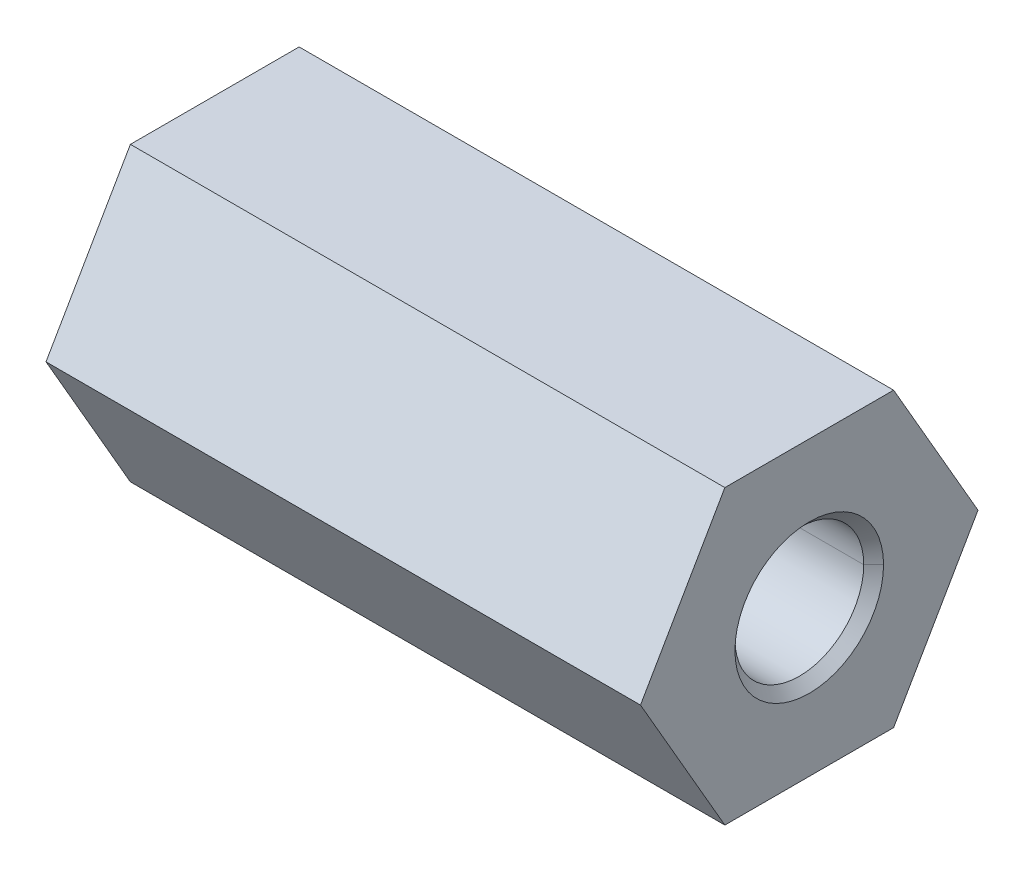
ISO-10303-21;
HEADER;
FILE_DESCRIPTION(('STEP AP214'),'2;1');
FILE_NAME('part.step','',(''),(''),'','','');
FILE_SCHEMA(('AUTOMOTIVE_DESIGN { 1 0 10303 214 1 1 1 1 }'));
ENDSEC;
DATA;
#1=APPLICATION_CONTEXT('core data for automotive mechanical design processes');
#2=APPLICATION_PROTOCOL_DEFINITION('international standard','automotive_design',2000,#1);
#3=PRODUCT_CONTEXT('',#1,'mechanical');
#4=PRODUCT('Part','Part','',(#3));
#5=PRODUCT_RELATED_PRODUCT_CATEGORY('part','',(#4));
#6=PRODUCT_DEFINITION_FORMATION('','',#4);
#7=PRODUCT_DEFINITION_CONTEXT('part definition',#1,'design');
#8=PRODUCT_DEFINITION('design','',#6,#7);
#9=PRODUCT_DEFINITION_SHAPE('','',#8);
#10=(LENGTH_UNIT() NAMED_UNIT(*) SI_UNIT(.MILLI.,.METRE.));
#11=(NAMED_UNIT(*) PLANE_ANGLE_UNIT() SI_UNIT($,.RADIAN.));
#12=(NAMED_UNIT(*) SI_UNIT($,.STERADIAN.) SOLID_ANGLE_UNIT());
#13=UNCERTAINTY_MEASURE_WITH_UNIT(LENGTH_MEASURE(1.E-05),#10,'distance_accuracy_value','');
#14=(GEOMETRIC_REPRESENTATION_CONTEXT(3) GLOBAL_UNCERTAINTY_ASSIGNED_CONTEXT((#13)) GLOBAL_UNIT_ASSIGNED_CONTEXT((#10,
#11,#12)) REPRESENTATION_CONTEXT('',''));
#15=CARTESIAN_POINT('',(0.,0.,0.));
#16=DIRECTION('',(0.,0.,1.));
#17=DIRECTION('',(1.,0.,0.));
#18=AXIS2_PLACEMENT_3D('',#15,#16,#17);
#19=CARTESIAN_POINT('',(11.8,0.,0.));
#20=DIRECTION('',(1.,0.,0.));
#21=DIRECTION('',(0.,0.,-1.));
#22=AXIS2_PLACEMENT_3D('',#19,#20,#21);
#23=CONICAL_SURFACE('',#22,1.3,0.785398163397446);
#24=DIRECTION('',(0.707106781186549,0.,0.707106781186546));
#25=VECTOR('',#24,1.);
#26=CARTESIAN_POINT('',(11.8,0.,1.3));
#27=LINE('',#26,#25);
#28=CARTESIAN_POINT('',(11.8,0.,1.3));
#29=VERTEX_POINT('',#28);
#30=CARTESIAN_POINT('',(12.,0.,1.5));
#31=VERTEX_POINT('',#30);
#32=EDGE_CURVE('E310',#29,#31,#27,.T.);
#33=ORIENTED_EDGE('',*,*,#32,.F.);
#34=CARTESIAN_POINT('',(11.8,0.,0.));
#35=DIRECTION('',(1.,0.,0.));
#36=DIRECTION('',(0.,0.,-1.));
#37=AXIS2_PLACEMENT_3D('',#34,#35,#36);
#38=CIRCLE('',#37,1.3);
#39=CARTESIAN_POINT('',(11.8,0.,-1.3));
#40=VERTEX_POINT('',#39);
#41=EDGE_CURVE('E10',#40,#29,#38,.T.);
#42=ORIENTED_EDGE('',*,*,#41,.F.);
#43=DIRECTION('',(0.707106781186549,0.,-0.707106781186546));
#44=VECTOR('',#43,1.);
#45=CARTESIAN_POINT('',(11.8,0.,-1.3));
#46=LINE('',#45,#44);
#47=CARTESIAN_POINT('',(12.,0.,-1.5));
#48=VERTEX_POINT('',#47);
#49=EDGE_CURVE('E273',#40,#48,#46,.T.);
#50=ORIENTED_EDGE('',*,*,#49,.T.);
#51=CARTESIAN_POINT('',(12.,0.,0.));
#52=DIRECTION('',(-1.,0.,0.));
#53=DIRECTION('',(0.,0.,-1.));
#54=AXIS2_PLACEMENT_3D('',#51,#52,#53);
#55=CIRCLE('',#54,1.5);
#56=EDGE_CURVE('E233',#31,#48,#55,.T.);
#57=ORIENTED_EDGE('',*,*,#56,.F.);
#58=EDGE_LOOP('',(#33,#42,#50,#57));
#59=FACE_BOUND('',#58,.T.);
#60=ADVANCED_FACE('F16',(#59),#23,.F.);
#61=CARTESIAN_POINT('',(0.,0.,0.));
#62=DIRECTION('',(1.,0.,0.));
#63=DIRECTION('',(0.,0.,-1.));
#64=AXIS2_PLACEMENT_3D('',#61,#62,#63);
#65=CYLINDRICAL_SURFACE('',#64,1.3);
#66=DIRECTION('',(1.,0.,0.));
#67=VECTOR('',#66,1.);
#68=CARTESIAN_POINT('',(0.,0.,1.3));
#69=LINE('',#68,#67);
#70=CARTESIAN_POINT('',(8.,0.,1.3));
#71=VERTEX_POINT('',#70);
#72=EDGE_CURVE('E258',#71,#29,#69,.T.);
#73=ORIENTED_EDGE('',*,*,#72,.F.);
#74=CARTESIAN_POINT('',(8.,0.,0.));
#75=DIRECTION('',(-1.,0.,0.));
#76=DIRECTION('',(0.,0.,1.));
#77=AXIS2_PLACEMENT_3D('',#74,#75,#76);
#78=CIRCLE('',#77,1.3);
#79=CARTESIAN_POINT('',(8.,0.,-1.3));
#80=VERTEX_POINT('',#79);
#81=EDGE_CURVE('E24',#71,#80,#78,.T.);
#82=ORIENTED_EDGE('',*,*,#81,.T.);
#83=DIRECTION('',(1.,0.,0.));
#84=VECTOR('',#83,1.);
#85=CARTESIAN_POINT('',(0.,0.,-1.3));
#86=LINE('',#85,#84);
#87=EDGE_CURVE('E255',#80,#40,#86,.T.);
#88=ORIENTED_EDGE('',*,*,#87,.T.);
#89=ORIENTED_EDGE('',*,*,#41,.T.);
#90=EDGE_LOOP('',(#73,#82,#88,#89));
#91=FACE_BOUND('',#90,.T.);
#92=ADVANCED_FACE('F254',(#91),#65,.F.);
#93=CARTESIAN_POINT('',(8.,0.,0.));
#94=DIRECTION('',(-1.,0.,0.));
#95=DIRECTION('',(0.,0.,1.));
#96=AXIS2_PLACEMENT_3D('',#93,#94,#95);
#97=PLANE('',#96);
#98=CARTESIAN_POINT('',(8.,0.,0.));
#99=DIRECTION('',(-1.,0.,0.));
#100=DIRECTION('',(0.,0.,1.));
#101=AXIS2_PLACEMENT_3D('',#98,#99,#100);
#102=CIRCLE('',#101,1.3);
#103=EDGE_CURVE('E265',#80,#71,#102,.T.);
#104=ORIENTED_EDGE('',*,*,#103,.F.);
#105=ORIENTED_EDGE('',*,*,#81,.F.);
#106=EDGE_LOOP('',(#104,#105));
#107=FACE_BOUND('',#106,.T.);
#108=CARTESIAN_POINT('',(8.,0.,0.));
#109=DIRECTION('',(-1.,0.,0.));
#110=DIRECTION('',(0.,0.,1.));
#111=AXIS2_PLACEMENT_3D('',#108,#109,#110);
#112=CIRCLE('',#111,2.);
#113=CARTESIAN_POINT('',(8.,1.5,-1.32287565553229));
#114=VERTEX_POINT('',#113);
#115=CARTESIAN_POINT('',(8.,0.,-2.));
#116=VERTEX_POINT('',#115);
#117=EDGE_CURVE('E243',#114,#116,#112,.T.);
#118=ORIENTED_EDGE('',*,*,#117,.T.);
#119=CARTESIAN_POINT('',(8.,0.,0.));
#120=DIRECTION('',(-1.,0.,0.));
#121=DIRECTION('',(0.,0.,1.));
#122=AXIS2_PLACEMENT_3D('',#119,#120,#121);
#123=CIRCLE('',#122,2.);
#124=CARTESIAN_POINT('',(8.,0.,2.));
#125=VERTEX_POINT('',#124);
#126=EDGE_CURVE('E269',#116,#125,#123,.T.);
#127=ORIENTED_EDGE('',*,*,#126,.T.);
#128=CARTESIAN_POINT('',(8.,0.,0.));
#129=DIRECTION('',(-1.,0.,0.));
#130=DIRECTION('',(0.,0.,1.));
#131=AXIS2_PLACEMENT_3D('',#128,#129,#130);
#132=CIRCLE('',#131,2.);
#133=CARTESIAN_POINT('',(8.,1.5,1.32287565553229));
#134=VERTEX_POINT('',#133);
#135=EDGE_CURVE('E293',#125,#134,#132,.T.);
#136=ORIENTED_EDGE('',*,*,#135,.T.);
#137=DIRECTION('',(0.,0.,-1.));
#138=VECTOR('',#137,1.);
#139=CARTESIAN_POINT('',(8.,1.5,1.32287565553229));
#140=LINE('',#139,#138);
#141=EDGE_CURVE('E37',#134,#114,#140,.T.);
#142=ORIENTED_EDGE('',*,*,#141,.T.);
#143=EDGE_LOOP('',(#118,#127,#136,#142));
#144=FACE_BOUND('',#143,.T.);
#145=ADVANCED_FACE('F271',(#107,#144),#97,.T.);
#146=CARTESIAN_POINT('',(8.,1.5,1.32287565553229));
#147=DIRECTION('',(0.,1.,0.));
#148=DIRECTION('',(0.,0.,-1.));
#149=AXIS2_PLACEMENT_3D('',#146,#147,#148);
#150=PLANE('',#149);
#151=DIRECTION('',(0.,0.,-1.));
#152=VECTOR('',#151,1.);
#153=CARTESIAN_POINT('',(0.,1.5,1.32287565553229));
#154=LINE('',#153,#152);
#155=CARTESIAN_POINT('',(0.,1.5,1.32287565553229));
#156=VERTEX_POINT('',#155);
#157=CARTESIAN_POINT('',(0.,1.5,-1.32287565553229));
#158=VERTEX_POINT('',#157);
#159=EDGE_CURVE('E236',#156,#158,#154,.T.);
#160=ORIENTED_EDGE('',*,*,#159,.T.);
#161=DIRECTION('',(-1.,0.,0.));
#162=VECTOR('',#161,1.);
#163=CARTESIAN_POINT('',(8.,1.5,-1.32287565553229));
#164=LINE('',#163,#162);
#165=EDGE_CURVE('E47',#114,#158,#164,.T.);
#166=ORIENTED_EDGE('',*,*,#165,.F.);
#167=ORIENTED_EDGE('',*,*,#141,.F.);
#168=DIRECTION('',(-1.,0.,0.));
#169=VECTOR('',#168,1.);
#170=CARTESIAN_POINT('',(8.,1.5,1.32287565553229));
#171=LINE('',#170,#169);
#172=EDGE_CURVE('E174',#134,#156,#171,.T.);
#173=ORIENTED_EDGE('',*,*,#172,.T.);
#174=EDGE_LOOP('',(#160,#166,#167,#173));
#175=FACE_BOUND('',#174,.T.);
#176=ADVANCED_FACE('F365',(#175),#150,.F.);
#177=CARTESIAN_POINT('',(8.,0.,0.));
#178=DIRECTION('',(-1.,0.,0.));
#179=DIRECTION('',(0.,0.,1.));
#180=AXIS2_PLACEMENT_3D('',#177,#178,#179);
#181=CYLINDRICAL_SURFACE('',#180,2.);
#182=DIRECTION('',(-1.,0.,0.));
#183=VECTOR('',#182,1.);
#184=CARTESIAN_POINT('',(8.,0.,-2.));
#185=LINE('',#184,#183);
#186=CARTESIAN_POINT('',(0.,0.,-2.));
#187=VERTEX_POINT('',#186);
#188=EDGE_CURVE('E288',#116,#187,#185,.T.);
#189=ORIENTED_EDGE('',*,*,#188,.F.);
#190=ORIENTED_EDGE('',*,*,#117,.F.);
#191=ORIENTED_EDGE('',*,*,#165,.T.);
#192=CARTESIAN_POINT('',(0.,0.,0.));
#193=DIRECTION('',(-1.,0.,0.));
#194=DIRECTION('',(0.,0.,1.));
#195=AXIS2_PLACEMENT_3D('',#192,#193,#194);
#196=CIRCLE('',#195,2.);
#197=EDGE_CURVE('E240',#158,#187,#196,.T.);
#198=ORIENTED_EDGE('',*,*,#197,.T.);
#199=EDGE_LOOP('',(#189,#190,#191,#198));
#200=FACE_BOUND('',#199,.T.);
#201=ADVANCED_FACE('F360',(#200),#181,.F.);
#202=CARTESIAN_POINT('',(0.,0.,0.));
#203=DIRECTION('',(1.,0.,0.));
#204=DIRECTION('',(0.,1.,0.));
#205=AXIS2_PLACEMENT_3D('',#202,#203,#204);
#206=PLANE('',#205);
#207=ORIENTED_EDGE('',*,*,#159,.F.);
#208=CARTESIAN_POINT('',(0.,0.,0.));
#209=DIRECTION('',(-1.,0.,0.));
#210=DIRECTION('',(0.,0.,1.));
#211=AXIS2_PLACEMENT_3D('',#208,#209,#210);
#212=CIRCLE('',#211,2.);
#213=CARTESIAN_POINT('',(0.,0.,2.));
#214=VERTEX_POINT('',#213);
#215=EDGE_CURVE('E183',#214,#156,#212,.T.);
#216=ORIENTED_EDGE('',*,*,#215,.F.);
#217=CARTESIAN_POINT('',(0.,0.,0.));
#218=DIRECTION('',(-1.,0.,0.));
#219=DIRECTION('',(0.,0.,1.));
#220=AXIS2_PLACEMENT_3D('',#217,#218,#219);
#221=CIRCLE('',#220,2.);
#222=EDGE_CURVE('E186',#187,#214,#221,.T.);
#223=ORIENTED_EDGE('',*,*,#222,.F.);
#224=ORIENTED_EDGE('',*,*,#197,.F.);
#225=EDGE_LOOP('',(#207,#216,#223,#224));
#226=FACE_BOUND('',#225,.T.);
#227=DIRECTION('',(0.,0.866025403784439,-0.5));
#228=VECTOR('',#227,1.);
#229=CARTESIAN_POINT('',(0.,-2.95,-1.7031832941094));
#230=LINE('',#229,#228);
#231=CARTESIAN_POINT('',(0.,-2.95,-1.7031832941094));
#232=VERTEX_POINT('',#231);
#233=CARTESIAN_POINT('',(0.,0.,-3.40636658821879));
#234=VERTEX_POINT('',#233);
#235=EDGE_CURVE('E163',#232,#234,#230,.T.);
#236=ORIENTED_EDGE('',*,*,#235,.F.);
#237=DIRECTION('',(0.,0.,-1.));
#238=VECTOR('',#237,1.);
#239=CARTESIAN_POINT('',(0.,-2.95,1.70318329410939));
#240=LINE('',#239,#238);
#241=CARTESIAN_POINT('',(0.,-2.95,1.70318329410939));
#242=VERTEX_POINT('',#241);
#243=EDGE_CURVE('E145',#242,#232,#240,.T.);
#244=ORIENTED_EDGE('',*,*,#243,.F.);
#245=DIRECTION('',(0.,-0.866025403784438,-0.5));
#246=VECTOR('',#245,1.);
#247=CARTESIAN_POINT('',(0.,0.,3.40636658821879));
#248=LINE('',#247,#246);
#249=CARTESIAN_POINT('',(0.,0.,3.40636658821879));
#250=VERTEX_POINT('',#249);
#251=EDGE_CURVE('E196',#250,#242,#248,.T.);
#252=ORIENTED_EDGE('',*,*,#251,.F.);
#253=DIRECTION('',(0.,-0.866025403784439,0.5));
#254=VECTOR('',#253,1.);
#255=CARTESIAN_POINT('',(0.,2.95,1.70318329410939));
#256=LINE('',#255,#254);
#257=CARTESIAN_POINT('',(0.,2.95,1.70318329410939));
#258=VERTEX_POINT('',#257);
#259=EDGE_CURVE('E217',#258,#250,#256,.T.);
#260=ORIENTED_EDGE('',*,*,#259,.F.);
#261=DIRECTION('',(0.,0.,1.));
#262=VECTOR('',#261,1.);
#263=CARTESIAN_POINT('',(0.,2.95,-1.70318329410939));
#264=LINE('',#263,#262);
#265=CARTESIAN_POINT('',(0.,2.95,-1.70318329410939));
#266=VERTEX_POINT('',#265);
#267=EDGE_CURVE('E207',#266,#258,#264,.T.);
#268=ORIENTED_EDGE('',*,*,#267,.F.);
#269=DIRECTION('',(0.,0.866025403784439,0.5));
#270=VECTOR('',#269,1.);
#271=CARTESIAN_POINT('',(0.,0.,-3.40636658821879));
#272=LINE('',#271,#270);
#273=EDGE_CURVE('E167',#234,#266,#272,.T.);
#274=ORIENTED_EDGE('',*,*,#273,.F.);
#275=EDGE_LOOP('',(#236,#244,#252,#260,#268,#274));
#276=FACE_BOUND('',#275,.T.);
#277=ADVANCED_FACE('F169',(#226,#276),#206,.F.);
#278=CARTESIAN_POINT('',(12.,0.,0.));
#279=DIRECTION('',(1.,0.,0.));
#280=DIRECTION('',(0.,1.,0.));
#281=AXIS2_PLACEMENT_3D('',#278,#279,#280);
#282=PLANE('',#281);
#283=CARTESIAN_POINT('',(12.,0.,0.));
#284=DIRECTION('',(-1.,0.,0.));
#285=DIRECTION('',(0.,0.,-1.));
#286=AXIS2_PLACEMENT_3D('',#283,#284,#285);
#287=CIRCLE('',#286,1.5);
#288=EDGE_CURVE('E281',#48,#31,#287,.T.);
#289=ORIENTED_EDGE('',*,*,#288,.T.);
#290=ORIENTED_EDGE('',*,*,#56,.T.);
#291=EDGE_LOOP('',(#289,#290));
#292=FACE_BOUND('',#291,.T.);
#293=DIRECTION('',(0.,0.866025403784439,-0.5));
#294=VECTOR('',#293,1.);
#295=CARTESIAN_POINT('',(12.,-2.95,-1.7031832941094));
#296=LINE('',#295,#294);
#297=CARTESIAN_POINT('',(12.,-2.95,-1.7031832941094));
#298=VERTEX_POINT('',#297);
#299=CARTESIAN_POINT('',(12.,0.,-3.40636658821879));
#300=VERTEX_POINT('',#299);
#301=EDGE_CURVE('E165',#298,#300,#296,.T.);
#302=ORIENTED_EDGE('',*,*,#301,.T.);
#303=DIRECTION('',(0.,0.866025403784439,0.5));
#304=VECTOR('',#303,1.);
#305=CARTESIAN_POINT('',(12.,0.,-3.40636658821879));
#306=LINE('',#305,#304);
#307=CARTESIAN_POINT('',(12.,2.95,-1.70318329410939));
#308=VERTEX_POINT('',#307);
#309=EDGE_CURVE('E201',#300,#308,#306,.T.);
#310=ORIENTED_EDGE('',*,*,#309,.T.);
#311=DIRECTION('',(0.,0.,1.));
#312=VECTOR('',#311,1.);
#313=CARTESIAN_POINT('',(12.,2.95,-1.70318329410939));
#314=LINE('',#313,#312);
#315=CARTESIAN_POINT('',(12.,2.95,1.70318329410939));
#316=VERTEX_POINT('',#315);
#317=EDGE_CURVE('E206',#308,#316,#314,.T.);
#318=ORIENTED_EDGE('',*,*,#317,.T.);
#319=DIRECTION('',(0.,-0.866025403784439,0.5));
#320=VECTOR('',#319,1.);
#321=CARTESIAN_POINT('',(12.,2.95,1.70318329410939));
#322=LINE('',#321,#320);
#323=CARTESIAN_POINT('',(12.,0.,3.40636658821879));
#324=VERTEX_POINT('',#323);
#325=EDGE_CURVE('E192',#316,#324,#322,.T.);
#326=ORIENTED_EDGE('',*,*,#325,.T.);
#327=DIRECTION('',(0.,-0.866025403784438,-0.5));
#328=VECTOR('',#327,1.);
#329=CARTESIAN_POINT('',(12.,0.,3.40636658821879));
#330=LINE('',#329,#328);
#331=CARTESIAN_POINT('',(12.,-2.95,1.70318329410939));
#332=VERTEX_POINT('',#331);
#333=EDGE_CURVE('E157',#324,#332,#330,.T.);
#334=ORIENTED_EDGE('',*,*,#333,.T.);
#335=DIRECTION('',(0.,0.,-1.));
#336=VECTOR('',#335,1.);
#337=CARTESIAN_POINT('',(12.,-2.95,1.70318329410939));
#338=LINE('',#337,#336);
#339=EDGE_CURVE('E156',#332,#298,#338,.T.);
#340=ORIENTED_EDGE('',*,*,#339,.T.);
#341=EDGE_LOOP('',(#302,#310,#318,#326,#334,#340));
#342=FACE_BOUND('',#341,.T.);
#343=ADVANCED_FACE('F321',(#292,#342),#282,.T.);
#344=CARTESIAN_POINT('',(12.,-2.95,1.70318329410939));
#345=DIRECTION('',(0.,1.,0.));
#346=DIRECTION('',(1.,0.,0.));
#347=AXIS2_PLACEMENT_3D('',#344,#345,#346);
#348=PLANE('',#347);
#349=ORIENTED_EDGE('',*,*,#243,.T.);
#350=DIRECTION('',(-1.,0.,0.));
#351=VECTOR('',#350,1.);
#352=CARTESIAN_POINT('',(12.,-2.95,-1.7031832941094));
#353=LINE('',#352,#351);
#354=EDGE_CURVE('E148',#298,#232,#353,.T.);
#355=ORIENTED_EDGE('',*,*,#354,.F.);
#356=ORIENTED_EDGE('',*,*,#339,.F.);
#357=DIRECTION('',(-1.,0.,0.));
#358=VECTOR('',#357,1.);
#359=CARTESIAN_POINT('',(12.,-2.95,1.70318329410939));
#360=LINE('',#359,#358);
#361=EDGE_CURVE('E151',#332,#242,#360,.T.);
#362=ORIENTED_EDGE('',*,*,#361,.T.);
#363=EDGE_LOOP('',(#349,#355,#356,#362));
#364=FACE_BOUND('',#363,.T.);
#365=ADVANCED_FACE('F147',(#364),#348,.F.);
#366=CARTESIAN_POINT('',(12.,0.,3.40636658821879));
#367=DIRECTION('',(0.,0.5,-0.866025403784439));
#368=DIRECTION('',(-1.,0.,0.));
#369=AXIS2_PLACEMENT_3D('',#366,#367,#368);
#370=PLANE('',#369);
#371=ORIENTED_EDGE('',*,*,#251,.T.);
#372=ORIENTED_EDGE('',*,*,#361,.F.);
#373=ORIENTED_EDGE('',*,*,#333,.F.);
#374=DIRECTION('',(-1.,0.,0.));
#375=VECTOR('',#374,1.);
#376=CARTESIAN_POINT('',(12.,0.,3.40636658821879));
#377=LINE('',#376,#375);
#378=EDGE_CURVE('E197',#324,#250,#377,.T.);
#379=ORIENTED_EDGE('',*,*,#378,.T.);
#380=EDGE_LOOP('',(#371,#372,#373,#379));
#381=FACE_BOUND('',#380,.T.);
#382=ADVANCED_FACE('F332',(#381),#370,.F.);
#383=CARTESIAN_POINT('',(12.,2.95,1.70318329410939));
#384=DIRECTION('',(0.,-0.5,-0.866025403784439));
#385=DIRECTION('',(0.,-0.866025403784439,0.5));
#386=AXIS2_PLACEMENT_3D('',#383,#384,#385);
#387=PLANE('',#386);
#388=ORIENTED_EDGE('',*,*,#259,.T.);
#389=ORIENTED_EDGE('',*,*,#378,.F.);
#390=ORIENTED_EDGE('',*,*,#325,.F.);
#391=DIRECTION('',(-1.,0.,0.));
#392=VECTOR('',#391,1.);
#393=CARTESIAN_POINT('',(12.,2.95,1.70318329410939));
#394=LINE('',#393,#392);
#395=EDGE_CURVE('E202',#316,#258,#394,.T.);
#396=ORIENTED_EDGE('',*,*,#395,.T.);
#397=EDGE_LOOP('',(#388,#389,#390,#396));
#398=FACE_BOUND('',#397,.T.);
#399=ADVANCED_FACE('F330',(#398),#387,.F.);
#400=CARTESIAN_POINT('',(12.,2.95,-1.70318329410939));
#401=DIRECTION('',(0.,-1.,0.));
#402=DIRECTION('',(0.,0.,-1.));
#403=AXIS2_PLACEMENT_3D('',#400,#401,#402);
#404=PLANE('',#403);
#405=ORIENTED_EDGE('',*,*,#267,.T.);
#406=ORIENTED_EDGE('',*,*,#395,.F.);
#407=ORIENTED_EDGE('',*,*,#317,.F.);
#408=DIRECTION('',(-1.,0.,0.));
#409=VECTOR('',#408,1.);
#410=CARTESIAN_POINT('',(12.,2.95,-1.70318329410939));
#411=LINE('',#410,#409);
#412=EDGE_CURVE('E191',#308,#266,#411,.T.);
#413=ORIENTED_EDGE('',*,*,#412,.T.);
#414=EDGE_LOOP('',(#405,#406,#407,#413));
#415=FACE_BOUND('',#414,.T.);
#416=ADVANCED_FACE('F326',(#415),#404,.F.);
#417=CARTESIAN_POINT('',(12.,0.,-3.40636658821879));
#418=DIRECTION('',(0.,-0.5,0.866025403784439));
#419=DIRECTION('',(-1.,0.,0.));
#420=AXIS2_PLACEMENT_3D('',#417,#418,#419);
#421=PLANE('',#420);
#422=ORIENTED_EDGE('',*,*,#273,.T.);
#423=ORIENTED_EDGE('',*,*,#412,.F.);
#424=ORIENTED_EDGE('',*,*,#309,.F.);
#425=DIRECTION('',(-1.,0.,0.));
#426=VECTOR('',#425,1.);
#427=CARTESIAN_POINT('',(12.,0.,-3.40636658821879));
#428=LINE('',#427,#426);
#429=EDGE_CURVE('E173',#300,#234,#428,.T.);
#430=ORIENTED_EDGE('',*,*,#429,.T.);
#431=EDGE_LOOP('',(#422,#423,#424,#430));
#432=FACE_BOUND('',#431,.T.);
#433=ADVANCED_FACE('F324',(#432),#421,.F.);
#434=CARTESIAN_POINT('',(12.,-2.95,-1.7031832941094));
#435=DIRECTION('',(0.,0.5,0.866025403784439));
#436=DIRECTION('',(1.,0.,0.));
#437=AXIS2_PLACEMENT_3D('',#434,#435,#436);
#438=PLANE('',#437);
#439=ORIENTED_EDGE('',*,*,#235,.T.);
#440=ORIENTED_EDGE('',*,*,#429,.F.);
#441=ORIENTED_EDGE('',*,*,#301,.F.);
#442=ORIENTED_EDGE('',*,*,#354,.T.);
#443=EDGE_LOOP('',(#439,#440,#441,#442));
#444=FACE_BOUND('',#443,.T.);
#445=ADVANCED_FACE('F161',(#444),#438,.F.);
#446=CARTESIAN_POINT('',(8.,0.,0.));
#447=DIRECTION('',(-1.,0.,0.));
#448=DIRECTION('',(0.,0.,1.));
#449=AXIS2_PLACEMENT_3D('',#446,#447,#448);
#450=CYLINDRICAL_SURFACE('',#449,2.);
#451=ORIENTED_EDGE('',*,*,#135,.F.);
#452=DIRECTION('',(-1.,0.,0.));
#453=VECTOR('',#452,1.);
#454=CARTESIAN_POINT('',(8.,0.,2.));
#455=LINE('',#454,#453);
#456=EDGE_CURVE('E300',#125,#214,#455,.T.);
#457=ORIENTED_EDGE('',*,*,#456,.T.);
#458=ORIENTED_EDGE('',*,*,#215,.T.);
#459=ORIENTED_EDGE('',*,*,#172,.F.);
#460=EDGE_LOOP('',(#451,#457,#458,#459));
#461=FACE_BOUND('',#460,.T.);
#462=ADVANCED_FACE('F379',(#461),#450,.F.);
#463=CARTESIAN_POINT('',(8.,0.,0.));
#464=DIRECTION('',(-1.,0.,0.));
#465=DIRECTION('',(0.,0.,1.));
#466=AXIS2_PLACEMENT_3D('',#463,#464,#465);
#467=CYLINDRICAL_SURFACE('',#466,2.);
#468=ORIENTED_EDGE('',*,*,#126,.F.);
#469=ORIENTED_EDGE('',*,*,#188,.T.);
#470=ORIENTED_EDGE('',*,*,#222,.T.);
#471=ORIENTED_EDGE('',*,*,#456,.F.);
#472=EDGE_LOOP('',(#468,#469,#470,#471));
#473=FACE_BOUND('',#472,.T.);
#474=ADVANCED_FACE('F378',(#473),#467,.F.);
#475=CARTESIAN_POINT('',(0.,0.,0.));
#476=DIRECTION('',(1.,0.,0.));
#477=DIRECTION('',(0.,0.,-1.));
#478=AXIS2_PLACEMENT_3D('',#475,#476,#477);
#479=CYLINDRICAL_SURFACE('',#478,1.3);
#480=ORIENTED_EDGE('',*,*,#103,.T.);
#481=ORIENTED_EDGE('',*,*,#72,.T.);
#482=CARTESIAN_POINT('',(11.8,0.,0.));
#483=DIRECTION('',(1.,0.,0.));
#484=DIRECTION('',(0.,0.,-1.));
#485=AXIS2_PLACEMENT_3D('',#482,#483,#484);
#486=CIRCLE('',#485,1.3);
#487=EDGE_CURVE('E267',#29,#40,#486,.T.);
#488=ORIENTED_EDGE('',*,*,#487,.T.);
#489=ORIENTED_EDGE('',*,*,#87,.F.);
#490=EDGE_LOOP('',(#480,#481,#488,#489));
#491=FACE_BOUND('',#490,.T.);
#492=ADVANCED_FACE('F264',(#491),#479,.F.);
#493=CARTESIAN_POINT('',(11.8,0.,0.));
#494=DIRECTION('',(1.,0.,0.));
#495=DIRECTION('',(0.,0.,-1.));
#496=AXIS2_PLACEMENT_3D('',#493,#494,#495);
#497=CONICAL_SURFACE('',#496,1.3,0.785398163397446);
#498=ORIENTED_EDGE('',*,*,#487,.F.);
#499=ORIENTED_EDGE('',*,*,#32,.T.);
#500=ORIENTED_EDGE('',*,*,#288,.F.);
#501=ORIENTED_EDGE('',*,*,#49,.F.);
#502=EDGE_LOOP('',(#498,#499,#500,#501));
#503=FACE_BOUND('',#502,.T.);
#504=ADVANCED_FACE('F353',(#503),#497,.F.);
#505=CLOSED_SHELL('',(#60,#92,#145,#176,#201,#277,#343,#365,#382,#399,#416,#433,#445,#462,#474,
#492,#504));
#506=MANIFOLD_SOLID_BREP('B1',#505);
#507=ADVANCED_BREP_SHAPE_REPRESENTATION('',(#18,#506),#14);
#508=SHAPE_DEFINITION_REPRESENTATION(#9,#507);
ENDSEC;
END-ISO-10303-21;
